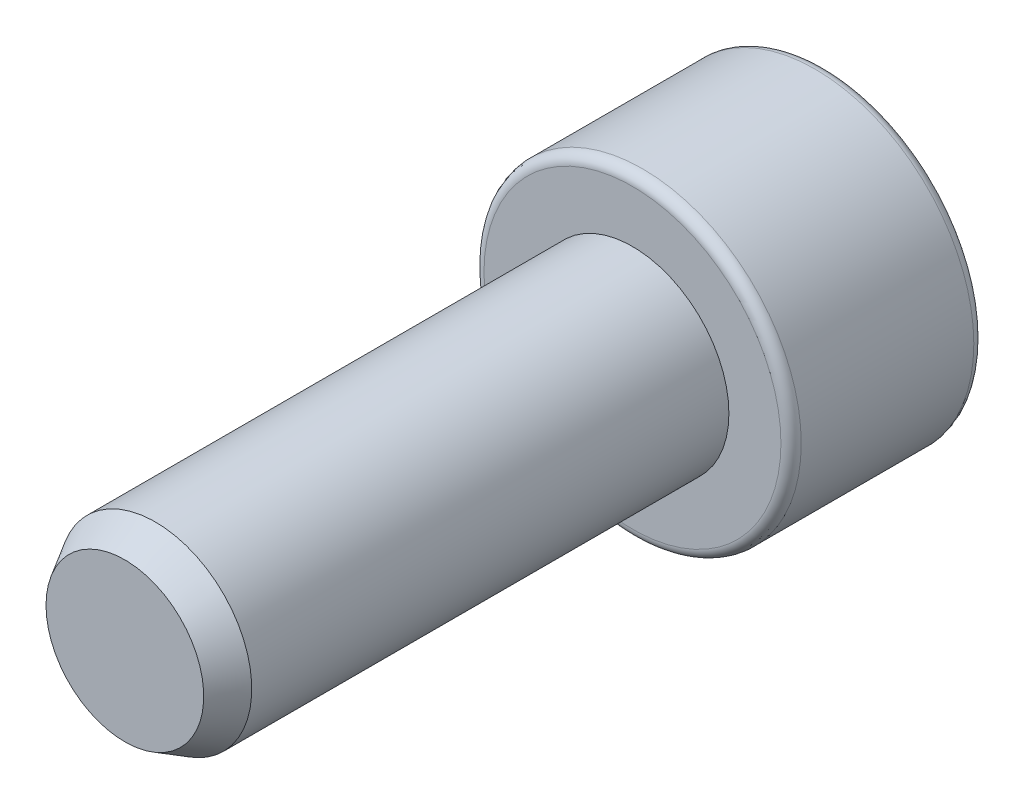
ISO-10303-21;
HEADER;
FILE_DESCRIPTION(('STEP AP214'),'2;1');
FILE_NAME('part.step','',(''),(''),'','','');
FILE_SCHEMA(('AUTOMOTIVE_DESIGN { 1 0 10303 214 1 1 1 1 }'));
ENDSEC;
DATA;
#1=APPLICATION_CONTEXT('core data for automotive mechanical design processes');
#2=APPLICATION_PROTOCOL_DEFINITION('international standard','automotive_design',2000,#1);
#3=PRODUCT_CONTEXT('',#1,'mechanical');
#4=PRODUCT('Part','Part','',(#3));
#5=PRODUCT_RELATED_PRODUCT_CATEGORY('part','',(#4));
#6=PRODUCT_DEFINITION_FORMATION('','',#4);
#7=PRODUCT_DEFINITION_CONTEXT('part definition',#1,'design');
#8=PRODUCT_DEFINITION('design','',#6,#7);
#9=PRODUCT_DEFINITION_SHAPE('','',#8);
#10=(LENGTH_UNIT() NAMED_UNIT(*) SI_UNIT(.MILLI.,.METRE.));
#11=(NAMED_UNIT(*) PLANE_ANGLE_UNIT() SI_UNIT($,.RADIAN.));
#12=(NAMED_UNIT(*) SI_UNIT($,.STERADIAN.) SOLID_ANGLE_UNIT());
#13=UNCERTAINTY_MEASURE_WITH_UNIT(LENGTH_MEASURE(1.E-05),#10,'distance_accuracy_value','');
#14=(GEOMETRIC_REPRESENTATION_CONTEXT(3) GLOBAL_UNCERTAINTY_ASSIGNED_CONTEXT((#13)) GLOBAL_UNIT_ASSIGNED_CONTEXT((#10,
#11,#12)) REPRESENTATION_CONTEXT('',''));
#15=CARTESIAN_POINT('',(0.,0.,0.));
#16=DIRECTION('',(0.,0.,1.));
#17=DIRECTION('',(1.,0.,0.));
#18=AXIS2_PLACEMENT_3D('',#15,#16,#17);
#19=CARTESIAN_POINT('',(3.71474999999991,0.,4.826));
#20=DIRECTION('',(0.,0.,1.));
#21=DIRECTION('',(1.,0.,0.));
#22=AXIS2_PLACEMENT_3D('',#19,#20,#21);
#23=PLANE('',#22);
#24=CARTESIAN_POINT('',(0.,0.,4.826));
#25=DIRECTION('',(0.,0.,1.));
#26=DIRECTION('',(1.,0.,0.));
#27=AXIS2_PLACEMENT_3D('',#24,#25,#26);
#28=CIRCLE('',#27,3.7147499999999);
#29=CARTESIAN_POINT('',(3.71474999999991,0.,4.826));
#30=VERTEX_POINT('',#29);
#31=EDGE_CURVE('E133',#30,#30,#28,.T.);
#32=ORIENTED_EDGE('',*,*,#31,.T.);
#33=EDGE_LOOP('',(#32));
#34=FACE_BOUND('',#33,.T.);
#35=CARTESIAN_POINT('',(0.,0.,4.826));
#36=DIRECTION('',(0.,0.,1.));
#37=DIRECTION('',(1.,0.,0.));
#38=AXIS2_PLACEMENT_3D('',#35,#36,#37);
#39=CIRCLE('',#38,2.413);
#40=CARTESIAN_POINT('',(2.413,0.,4.826));
#41=VERTEX_POINT('',#40);
#42=EDGE_CURVE('E120',#41,#41,#39,.T.);
#43=ORIENTED_EDGE('',*,*,#42,.F.);
#44=EDGE_LOOP('',(#43));
#45=FACE_BOUND('',#44,.T.);
#46=ADVANCED_FACE('F30',(#34,#45),#23,.T.);
#47=CARTESIAN_POINT('',(0.,0.,0.));
#48=DIRECTION('',(0.,0.,-1.));
#49=DIRECTION('',(-1.,0.,0.));
#50=AXIS2_PLACEMENT_3D('',#47,#48,#49);
#51=PLANE('',#50);
#52=DIRECTION('',(0.866025403784439,0.5,0.));
#53=VECTOR('',#52,1.);
#54=CARTESIAN_POINT('',(-1.984375,1.14567944042317,0.));
#55=LINE('',#54,#53);
#56=CARTESIAN_POINT('',(-1.984375,1.14567944042317,0.));
#57=VERTEX_POINT('',#56);
#58=CARTESIAN_POINT('',(0.,2.29135888084633,0.));
#59=VERTEX_POINT('',#58);
#60=EDGE_CURVE('E45',#57,#59,#55,.T.);
#61=ORIENTED_EDGE('',*,*,#60,.F.);
#62=DIRECTION('',(0.,1.,0.));
#63=VECTOR('',#62,1.);
#64=CARTESIAN_POINT('',(-1.984375,-1.14567944042316,0.));
#65=LINE('',#64,#63);
#66=CARTESIAN_POINT('',(-1.984375,-1.14567944042316,0.));
#67=VERTEX_POINT('',#66);
#68=EDGE_CURVE('E129',#67,#57,#65,.T.);
#69=ORIENTED_EDGE('',*,*,#68,.F.);
#70=DIRECTION('',(-0.866025403784438,0.5,0.));
#71=VECTOR('',#70,1.);
#72=CARTESIAN_POINT('',(0.,-2.29135888084633,0.));
#73=LINE('',#72,#71);
#74=CARTESIAN_POINT('',(0.,-2.29135888084633,0.));
#75=VERTEX_POINT('',#74);
#76=EDGE_CURVE('E127',#75,#67,#73,.T.);
#77=ORIENTED_EDGE('',*,*,#76,.F.);
#78=DIRECTION('',(-0.866025403784438,-0.5,0.));
#79=VECTOR('',#78,1.);
#80=CARTESIAN_POINT('',(1.984375,-1.14567944042316,0.));
#81=LINE('',#80,#79);
#82=CARTESIAN_POINT('',(1.984375,-1.14567944042316,0.));
#83=VERTEX_POINT('',#82);
#84=EDGE_CURVE('E93',#83,#75,#81,.T.);
#85=ORIENTED_EDGE('',*,*,#84,.F.);
#86=DIRECTION('',(0.,-1.,0.));
#87=VECTOR('',#86,1.);
#88=CARTESIAN_POINT('',(1.984375,1.14567944042316,0.));
#89=LINE('',#88,#87);
#90=CARTESIAN_POINT('',(1.984375,1.14567944042316,0.));
#91=VERTEX_POINT('',#90);
#92=EDGE_CURVE('E123',#91,#83,#89,.T.);
#93=ORIENTED_EDGE('',*,*,#92,.F.);
#94=DIRECTION('',(0.866025403784439,-0.5,0.));
#95=VECTOR('',#94,1.);
#96=CARTESIAN_POINT('',(0.,2.29135888084633,0.));
#97=LINE('',#96,#95);
#98=EDGE_CURVE('E119',#59,#91,#97,.T.);
#99=ORIENTED_EDGE('',*,*,#98,.F.);
#100=EDGE_LOOP('',(#61,#69,#77,#85,#93,#99));
#101=FACE_BOUND('',#100,.T.);
#102=CARTESIAN_POINT('',(0.,0.,0.));
#103=DIRECTION('',(0.,0.,1.));
#104=DIRECTION('',(1.,0.,0.));
#105=AXIS2_PLACEMENT_3D('',#102,#103,#104);
#106=CIRCLE('',#105,3.7147499999999);
#107=CARTESIAN_POINT('',(3.71474999999991,0.,0.));
#108=VERTEX_POINT('',#107);
#109=EDGE_CURVE('E147',#108,#108,#106,.T.);
#110=ORIENTED_EDGE('',*,*,#109,.F.);
#111=EDGE_LOOP('',(#110));
#112=FACE_BOUND('',#111,.T.);
#113=ADVANCED_FACE('F163',(#101,#112),#51,.T.);
#114=CARTESIAN_POINT('',(0.,0.,0.254000000000035));
#115=DIRECTION('',(0.,0.,1.));
#116=DIRECTION('',(1.,0.,0.));
#117=AXIS2_PLACEMENT_3D('',#114,#115,#116);
#118=TOROIDAL_SURFACE('',#117,3.7147499999999,0.254000000000001);
#119=ORIENTED_EDGE('',*,*,#109,.T.);
#120=EDGE_LOOP('',(#119));
#121=FACE_BOUND('',#120,.T.);
#122=CARTESIAN_POINT('',(0.,0.,0.254000000000035));
#123=DIRECTION('',(0.,0.,1.));
#124=DIRECTION('',(1.,0.,0.));
#125=AXIS2_PLACEMENT_3D('',#122,#123,#124);
#126=CIRCLE('',#125,3.9687499999999);
#127=CARTESIAN_POINT('',(3.96874999999991,0.,0.254000000000035));
#128=VERTEX_POINT('',#127);
#129=EDGE_CURVE('E144',#128,#128,#126,.T.);
#130=ORIENTED_EDGE('',*,*,#129,.F.);
#131=EDGE_LOOP('',(#130));
#132=FACE_BOUND('',#131,.T.);
#133=ADVANCED_FACE('F169',(#121,#132),#118,.T.);
#134=CARTESIAN_POINT('',(0.,0.,0.));
#135=DIRECTION('',(0.,0.,1.));
#136=DIRECTION('',(1.,0.,0.));
#137=AXIS2_PLACEMENT_3D('',#134,#135,#136);
#138=CYLINDRICAL_SURFACE('',#137,3.9687499999999);
#139=ORIENTED_EDGE('',*,*,#129,.T.);
#140=EDGE_LOOP('',(#139));
#141=FACE_BOUND('',#140,.T.);
#142=CARTESIAN_POINT('',(0.,0.,4.572));
#143=DIRECTION('',(0.,0.,1.));
#144=DIRECTION('',(1.,0.,0.));
#145=AXIS2_PLACEMENT_3D('',#142,#143,#144);
#146=CIRCLE('',#145,3.9687499999999);
#147=CARTESIAN_POINT('',(3.96874999999991,0.,4.572));
#148=VERTEX_POINT('',#147);
#149=EDGE_CURVE('E141',#148,#148,#146,.T.);
#150=ORIENTED_EDGE('',*,*,#149,.F.);
#151=EDGE_LOOP('',(#150));
#152=FACE_BOUND('',#151,.T.);
#153=ADVANCED_FACE('F179',(#141,#152),#138,.T.);
#154=CARTESIAN_POINT('',(0.,0.,4.572));
#155=DIRECTION('',(0.,0.,1.));
#156=DIRECTION('',(1.,0.,0.));
#157=AXIS2_PLACEMENT_3D('',#154,#155,#156);
#158=TOROIDAL_SURFACE('',#157,3.7147499999999,0.254);
#159=ORIENTED_EDGE('',*,*,#149,.T.);
#160=EDGE_LOOP('',(#159));
#161=FACE_BOUND('',#160,.T.);
#162=ORIENTED_EDGE('',*,*,#31,.F.);
#163=EDGE_LOOP('',(#162));
#164=FACE_BOUND('',#163,.T.);
#165=ADVANCED_FACE('F176',(#161,#164),#158,.T.);
#166=CARTESIAN_POINT('',(-1.98437499999998,1.14567944042317,2.54000000000001));
#167=DIRECTION('',(-0.5,0.866025403784439,0.));
#168=DIRECTION('',(-0.866025403784439,-0.5,0.));
#169=AXIS2_PLACEMENT_3D('',#166,#167,#168);
#170=PLANE('',#169);
#171=ORIENTED_EDGE('',*,*,#60,.T.);
#172=DIRECTION('',(0.,0.,-1.));
#173=VECTOR('',#172,1.);
#174=CARTESIAN_POINT('',(0.,2.29135888084633,2.54));
#175=LINE('',#174,#173);
#176=CARTESIAN_POINT('',(0.,2.29135888084633,2.54));
#177=VERTEX_POINT('',#176);
#178=EDGE_CURVE('E75',#177,#59,#175,.T.);
#179=ORIENTED_EDGE('',*,*,#178,.F.);
#180=DIRECTION('',(0.866025403784439,0.5,0.));
#181=VECTOR('',#180,1.);
#182=CARTESIAN_POINT('',(-1.98437499999998,1.14567944042317,2.54000000000001));
#183=LINE('',#182,#181);
#184=CARTESIAN_POINT('',(-1.98437499999998,1.14567944042317,2.54000000000001));
#185=VERTEX_POINT('',#184);
#186=EDGE_CURVE('E131',#185,#177,#183,.T.);
#187=ORIENTED_EDGE('',*,*,#186,.F.);
#188=DIRECTION('',(0.,0.,-1.));
#189=VECTOR('',#188,1.);
#190=CARTESIAN_POINT('',(-1.98437499999998,1.14567944042317,2.54000000000001));
#191=LINE('',#190,#189);
#192=EDGE_CURVE('E53',#185,#57,#191,.T.);
#193=ORIENTED_EDGE('',*,*,#192,.T.);
#194=EDGE_LOOP('',(#171,#179,#187,#193));
#195=FACE_BOUND('',#194,.T.);
#196=ADVANCED_FACE('F174',(#195),#170,.F.);
#197=CARTESIAN_POINT('',(-1.98437499999998,-1.14567944042316,2.54000000000001));
#198=DIRECTION('',(-1.,0.,0.));
#199=DIRECTION('',(0.,0.,1.));
#200=AXIS2_PLACEMENT_3D('',#197,#198,#199);
#201=PLANE('',#200);
#202=ORIENTED_EDGE('',*,*,#68,.T.);
#203=ORIENTED_EDGE('',*,*,#192,.F.);
#204=DIRECTION('',(0.,1.,0.));
#205=VECTOR('',#204,1.);
#206=CARTESIAN_POINT('',(-1.98437499999998,-1.14567944042316,2.54000000000001));
#207=LINE('',#206,#205);
#208=CARTESIAN_POINT('',(-1.98437499999998,-1.14567944042316,2.54000000000001));
#209=VERTEX_POINT('',#208);
#210=EDGE_CURVE('E105',#209,#185,#207,.T.);
#211=ORIENTED_EDGE('',*,*,#210,.F.);
#212=DIRECTION('',(0.,0.,-1.));
#213=VECTOR('',#212,1.);
#214=CARTESIAN_POINT('',(-1.98437499999998,-1.14567944042316,2.54000000000001));
#215=LINE('',#214,#213);
#216=EDGE_CURVE('E97',#209,#67,#215,.T.);
#217=ORIENTED_EDGE('',*,*,#216,.T.);
#218=EDGE_LOOP('',(#202,#203,#211,#217));
#219=FACE_BOUND('',#218,.T.);
#220=ADVANCED_FACE('F212',(#219),#201,.F.);
#221=CARTESIAN_POINT('',(0.,-2.29135888084633,2.54));
#222=DIRECTION('',(-0.5,-0.866025403784438,0.));
#223=DIRECTION('',(0.866025403784438,-0.5,0.));
#224=AXIS2_PLACEMENT_3D('',#221,#222,#223);
#225=PLANE('',#224);
#226=ORIENTED_EDGE('',*,*,#76,.T.);
#227=ORIENTED_EDGE('',*,*,#216,.F.);
#228=DIRECTION('',(-0.866025403784438,0.5,0.));
#229=VECTOR('',#228,1.);
#230=CARTESIAN_POINT('',(0.,-2.29135888084633,2.54));
#231=LINE('',#230,#229);
#232=CARTESIAN_POINT('',(0.,-2.29135888084633,2.54));
#233=VERTEX_POINT('',#232);
#234=EDGE_CURVE('E101',#233,#209,#231,.T.);
#235=ORIENTED_EDGE('',*,*,#234,.F.);
#236=DIRECTION('',(0.,0.,-1.));
#237=VECTOR('',#236,1.);
#238=CARTESIAN_POINT('',(0.,-2.29135888084633,2.54));
#239=LINE('',#238,#237);
#240=EDGE_CURVE('E86',#233,#75,#239,.T.);
#241=ORIENTED_EDGE('',*,*,#240,.T.);
#242=EDGE_LOOP('',(#226,#227,#235,#241));
#243=FACE_BOUND('',#242,.T.);
#244=ADVANCED_FACE('F102',(#243),#225,.F.);
#245=CARTESIAN_POINT('',(1.98437500000002,-1.14567944042316,2.53999999999999));
#246=DIRECTION('',(0.5,-0.866025403784438,0.));
#247=DIRECTION('',(0.866025403784439,0.5,0.));
#248=AXIS2_PLACEMENT_3D('',#245,#246,#247);
#249=PLANE('',#248);
#250=ORIENTED_EDGE('',*,*,#84,.T.);
#251=ORIENTED_EDGE('',*,*,#240,.F.);
#252=DIRECTION('',(-0.866025403784438,-0.5,0.));
#253=VECTOR('',#252,1.);
#254=CARTESIAN_POINT('',(1.98437500000002,-1.14567944042316,2.53999999999999));
#255=LINE('',#254,#253);
#256=CARTESIAN_POINT('',(1.98437500000002,-1.14567944042316,2.53999999999999));
#257=VERTEX_POINT('',#256);
#258=EDGE_CURVE('E90',#257,#233,#255,.T.);
#259=ORIENTED_EDGE('',*,*,#258,.F.);
#260=DIRECTION('',(0.,0.,-1.));
#261=VECTOR('',#260,1.);
#262=CARTESIAN_POINT('',(1.98437500000002,-1.14567944042316,2.53999999999999));
#263=LINE('',#262,#261);
#264=EDGE_CURVE('E98',#257,#83,#263,.T.);
#265=ORIENTED_EDGE('',*,*,#264,.T.);
#266=EDGE_LOOP('',(#250,#251,#259,#265));
#267=FACE_BOUND('',#266,.T.);
#268=ADVANCED_FACE('F88',(#267),#249,.F.);
#269=CARTESIAN_POINT('',(1.98437500000002,1.14567944042316,2.53999999999999));
#270=DIRECTION('',(1.,0.,0.));
#271=DIRECTION('',(0.,0.,-1.));
#272=AXIS2_PLACEMENT_3D('',#269,#270,#271);
#273=PLANE('',#272);
#274=ORIENTED_EDGE('',*,*,#92,.T.);
#275=ORIENTED_EDGE('',*,*,#264,.F.);
#276=DIRECTION('',(0.,-1.,0.));
#277=VECTOR('',#276,1.);
#278=CARTESIAN_POINT('',(1.98437500000002,1.14567944042316,2.53999999999999));
#279=LINE('',#278,#277);
#280=CARTESIAN_POINT('',(1.98437500000002,1.14567944042316,2.53999999999999));
#281=VERTEX_POINT('',#280);
#282=EDGE_CURVE('E111',#281,#257,#279,.T.);
#283=ORIENTED_EDGE('',*,*,#282,.F.);
#284=DIRECTION('',(0.,0.,-1.));
#285=VECTOR('',#284,1.);
#286=CARTESIAN_POINT('',(1.98437500000002,1.14567944042316,2.53999999999999));
#287=LINE('',#286,#285);
#288=EDGE_CURVE('E136',#281,#91,#287,.T.);
#289=ORIENTED_EDGE('',*,*,#288,.T.);
#290=EDGE_LOOP('',(#274,#275,#283,#289));
#291=FACE_BOUND('',#290,.T.);
#292=ADVANCED_FACE('F230',(#291),#273,.F.);
#293=CARTESIAN_POINT('',(0.,2.29135888084633,2.54));
#294=DIRECTION('',(0.5,0.866025403784439,0.));
#295=DIRECTION('',(-0.866025403784439,0.5,0.));
#296=AXIS2_PLACEMENT_3D('',#293,#294,#295);
#297=PLANE('',#296);
#298=ORIENTED_EDGE('',*,*,#98,.T.);
#299=ORIENTED_EDGE('',*,*,#288,.F.);
#300=DIRECTION('',(0.866025403784439,-0.5,0.));
#301=VECTOR('',#300,1.);
#302=CARTESIAN_POINT('',(0.,2.29135888084633,2.54));
#303=LINE('',#302,#301);
#304=EDGE_CURVE('E113',#177,#281,#303,.T.);
#305=ORIENTED_EDGE('',*,*,#304,.F.);
#306=ORIENTED_EDGE('',*,*,#178,.T.);
#307=EDGE_LOOP('',(#298,#299,#305,#306));
#308=FACE_BOUND('',#307,.T.);
#309=ADVANCED_FACE('F237',(#308),#297,.F.);
#310=CARTESIAN_POINT('',(0.,2.29135888084633,2.54));
#311=DIRECTION('',(0.,0.,-1.));
#312=DIRECTION('',(-1.,0.,0.));
#313=AXIS2_PLACEMENT_3D('',#310,#311,#312);
#314=PLANE('',#313);
#315=ORIENTED_EDGE('',*,*,#186,.T.);
#316=ORIENTED_EDGE('',*,*,#304,.T.);
#317=ORIENTED_EDGE('',*,*,#282,.T.);
#318=ORIENTED_EDGE('',*,*,#258,.T.);
#319=ORIENTED_EDGE('',*,*,#234,.T.);
#320=ORIENTED_EDGE('',*,*,#210,.T.);
#321=EDGE_LOOP('',(#315,#316,#317,#318,#319,#320));
#322=FACE_BOUND('',#321,.T.);
#323=ADVANCED_FACE('F108',(#322),#314,.T.);
#324=CARTESIAN_POINT('',(0.,0.,17.526));
#325=DIRECTION('',(0.,0.,-1.));
#326=DIRECTION('',(-1.,0.,0.));
#327=AXIS2_PLACEMENT_3D('',#324,#325,#326);
#328=CYLINDRICAL_SURFACE('',#327,2.413);
#329=CARTESIAN_POINT('',(0.,0.,16.764));
#330=DIRECTION('',(0.,0.,1.));
#331=DIRECTION('',(1.,0.,0.));
#332=AXIS2_PLACEMENT_3D('',#329,#330,#331);
#333=CIRCLE('',#332,2.413);
#334=CARTESIAN_POINT('',(-2.413,0.,16.764));
#335=VERTEX_POINT('',#334);
#336=EDGE_CURVE('E11',#335,#335,#333,.F.);
#337=ORIENTED_EDGE('',*,*,#336,.T.);
#338=EDGE_LOOP('',(#337));
#339=FACE_BOUND('',#338,.T.);
#340=ORIENTED_EDGE('',*,*,#42,.T.);
#341=EDGE_LOOP('',(#340));
#342=FACE_BOUND('',#341,.T.);
#343=ADVANCED_FACE('F159',(#339,#342),#328,.T.);
#344=CARTESIAN_POINT('',(0.,0.,17.526));
#345=DIRECTION('',(0.,0.,1.));
#346=DIRECTION('',(1.,0.,0.));
#347=AXIS2_PLACEMENT_3D('',#344,#345,#346);
#348=PLANE('',#347);
#349=CARTESIAN_POINT('',(0.,0.,17.526));
#350=DIRECTION('',(0.,0.,1.));
#351=DIRECTION('',(1.,0.,0.));
#352=AXIS2_PLACEMENT_3D('',#349,#350,#351);
#353=CIRCLE('',#352,1.9730590948775);
#354=CARTESIAN_POINT('',(-1.9730590948775,0.,17.526));
#355=VERTEX_POINT('',#354);
#356=EDGE_CURVE('E38',#355,#355,#353,.T.);
#357=ORIENTED_EDGE('',*,*,#356,.T.);
#358=EDGE_LOOP('',(#357));
#359=FACE_BOUND('',#358,.T.);
#360=ADVANCED_FACE('F152',(#359),#348,.T.);
#361=CARTESIAN_POINT('',(0.,0.,17.526));
#362=DIRECTION('',(0.,0.,-1.));
#363=DIRECTION('',(-1.,0.,0.));
#364=AXIS2_PLACEMENT_3D('',#361,#362,#363);
#365=CONICAL_SURFACE('',#364,1.9730590948775,0.523598775598297);
#366=CARTESIAN_POINT('',(-2.413,0.,16.764));
#367=CARTESIAN_POINT('',(-2.40841728223831,0.,16.7719375));
#368=CARTESIAN_POINT('',(-2.40383456447662,0.,16.779875));
#369=CARTESIAN_POINT('',(-2.39466912895323,0.,16.79575));
#370=CARTESIAN_POINT('',(-2.39008641119154,0.,16.8036875));
#371=CARTESIAN_POINT('',(-2.38092097566815,0.,16.8195625));
#372=CARTESIAN_POINT('',(-2.37633825790646,0.,16.8275));
#373=CARTESIAN_POINT('',(-2.36717282238307,0.,16.843375));
#374=CARTESIAN_POINT('',(-2.36259010462138,0.,16.8513125));
#375=CARTESIAN_POINT('',(-2.353424669098,0.,16.8671875));
#376=CARTESIAN_POINT('',(-2.3488419513363,0.,16.875125));
#377=CARTESIAN_POINT('',(-2.33967651581292,0.,16.891));
#378=CARTESIAN_POINT('',(-2.33509379805122,0.,16.8989375));
#379=CARTESIAN_POINT('',(-2.32592836252784,0.,16.9148125));
#380=CARTESIAN_POINT('',(-2.32134564476615,0.,16.92275));
#381=CARTESIAN_POINT('',(-2.31218020924276,0.,16.938625));
#382=CARTESIAN_POINT('',(-2.30759749148107,0.,16.9465625));
#383=CARTESIAN_POINT('',(-2.29843205595768,0.,16.9624375));
#384=CARTESIAN_POINT('',(-2.29384933819599,0.,16.970375));
#385=CARTESIAN_POINT('',(-2.2846839026726,0.,16.98625));
#386=CARTESIAN_POINT('',(-2.28010118491091,0.,16.9941875));
#387=CARTESIAN_POINT('',(-2.27093574938753,0.,17.0100625));
#388=CARTESIAN_POINT('',(-2.26635303162583,0.,17.018));
#389=CARTESIAN_POINT('',(-2.25718759610245,0.,17.033875));
#390=CARTESIAN_POINT('',(-2.25260487834076,0.,17.0418125));
#391=CARTESIAN_POINT('',(-2.24343944281737,0.,17.0576875));
#392=CARTESIAN_POINT('',(-2.23885672505568,0.,17.065625));
#393=CARTESIAN_POINT('',(-2.22969128953229,0.,17.0815));
#394=CARTESIAN_POINT('',(-2.2251085717706,0.,17.0894375));
#395=CARTESIAN_POINT('',(-2.21594313624721,0.,17.1053125));
#396=CARTESIAN_POINT('',(-2.21136041848552,0.,17.11325));
#397=CARTESIAN_POINT('',(-2.20219498296214,0.,17.129125));
#398=CARTESIAN_POINT('',(-2.19761226520044,0.,17.1370625));
#399=CARTESIAN_POINT('',(-2.18844682967706,0.,17.1529375));
#400=CARTESIAN_POINT('',(-2.18386411191536,0.,17.160875));
#401=CARTESIAN_POINT('',(-2.17469867639198,0.,17.17675));
#402=CARTESIAN_POINT('',(-2.17011595863029,0.,17.1846875));
#403=CARTESIAN_POINT('',(-2.1609505231069,0.,17.2005625));
#404=CARTESIAN_POINT('',(-2.15636780534521,0.,17.2085));
#405=CARTESIAN_POINT('',(-2.14720236982182,0.,17.224375));
#406=CARTESIAN_POINT('',(-2.14261965206013,0.,17.2323125));
#407=CARTESIAN_POINT('',(-2.13345421653674,0.,17.2481875));
#408=CARTESIAN_POINT('',(-2.12887149877505,0.,17.256125));
#409=CARTESIAN_POINT('',(-2.11970606325167,0.,17.272));
#410=CARTESIAN_POINT('',(-2.11512334548997,0.,17.2799375));
#411=CARTESIAN_POINT('',(-2.10595790996659,0.,17.2958125));
#412=CARTESIAN_POINT('',(-2.1013751922049,0.,17.30375));
#413=CARTESIAN_POINT('',(-2.09220975668151,0.,17.319625));
#414=CARTESIAN_POINT('',(-2.08762703891982,0.,17.3275625));
#415=CARTESIAN_POINT('',(-2.07846160339643,0.,17.3434375));
#416=CARTESIAN_POINT('',(-2.07387888563474,0.,17.351375));
#417=CARTESIAN_POINT('',(-2.06471345011135,0.,17.36725));
#418=CARTESIAN_POINT('',(-2.06013073234966,0.,17.3751875));
#419=CARTESIAN_POINT('',(-2.05096529682628,0.,17.3910625));
#420=CARTESIAN_POINT('',(-2.04638257906458,0.,17.399));
#421=CARTESIAN_POINT('',(-2.0372171435412,0.,17.414875));
#422=CARTESIAN_POINT('',(-2.03263442577951,0.,17.4228125));
#423=CARTESIAN_POINT('',(-2.02346899025612,0.,17.4386875));
#424=CARTESIAN_POINT('',(-2.01888627249443,0.,17.446625));
#425=CARTESIAN_POINT('',(-2.00972083697104,0.,17.4625));
#426=CARTESIAN_POINT('',(-2.00513811920935,0.,17.4704375));
#427=CARTESIAN_POINT('',(-1.99597268368596,0.,17.4863125));
#428=CARTESIAN_POINT('',(-1.99138996592427,0.,17.49425));
#429=CARTESIAN_POINT('',(-1.98222453040089,0.,17.510125));
#430=CARTESIAN_POINT('',(-1.97764181263919,0.,17.5180625));
#431=CARTESIAN_POINT('',(-1.9730590948775,0.,17.526));
#432=B_SPLINE_CURVE_WITH_KNOTS('',3,(#366,#367,#368,#369,#370,#371,#372,#373,#374,#375,#376,
#377,#378,#379,#380,#381,#382,#383,#384,#385,#386,#387,#388,#389,#390,#391,#392,#393,#394,#395,
#396,#397,#398,#399,#400,#401,#402,#403,#404,#405,#406,#407,#408,#409,#410,#411,#412,#413,#414,
#415,#416,#417,#418,#419,#420,#421,#422,#423,#424,#425,#426,#427,#428,#429,#430,#431),
.UNSPECIFIED.,.F.,.F.,(4,2,2,2,2,2,2,2,2,2,2,2,2,2,2,2,2,2,2,2,2,2,2,2,2,2,2,2,2,2,2,2,4),(0.,
0.0274963065701572,0.0549926131403143,0.0824889197104713,0.109985226280625,0.137481532850783,
0.16497783942094,0.192474145991097,0.219970452561251,0.247466759131408,0.274963065701565,
0.302459372271722,0.329955678841876,0.357451985412034,0.384948291982191,0.412444598552348,
0.439940905122502,0.467437211692659,0.494933518262816,0.522429824832973,0.549926131403127,
0.577422437973284,0.604918744543442,0.632415051113599,0.659911357683756,0.68740766425391,
0.714903970824067,0.742400277394224,0.769896583964381,0.797392890534535,0.824889197104692,
0.852385503674849,0.879881810245007),.UNSPECIFIED.);
#433=EDGE_CURVE('BSEAM32',#335,#355,#432,.T.);
#434=ORIENTED_EDGE('',*,*,#336,.F.);
#435=ORIENTED_EDGE('',*,*,#356,.F.);
#436=ORIENTED_EDGE('',*,*,#433,.T.);
#437=ORIENTED_EDGE('',*,*,#433,.F.);
#438=EDGE_LOOP('',(#434,#436,#435,#437));
#439=FACE_BOUND('',#438,.T.);
#440=ADVANCED_FACE('F32',(#439),#365,.T.);
#441=CLOSED_SHELL('',(#46,#113,#133,#153,#165,#196,#220,#244,#268,#292,#309,#323,#343,#360,#440));
#442=MANIFOLD_SOLID_BREP('B2',#441);
#443=ADVANCED_BREP_SHAPE_REPRESENTATION('',(#18,#442),#14);
#444=SHAPE_DEFINITION_REPRESENTATION(#9,#443);
ENDSEC;
END-ISO-10303-21;
